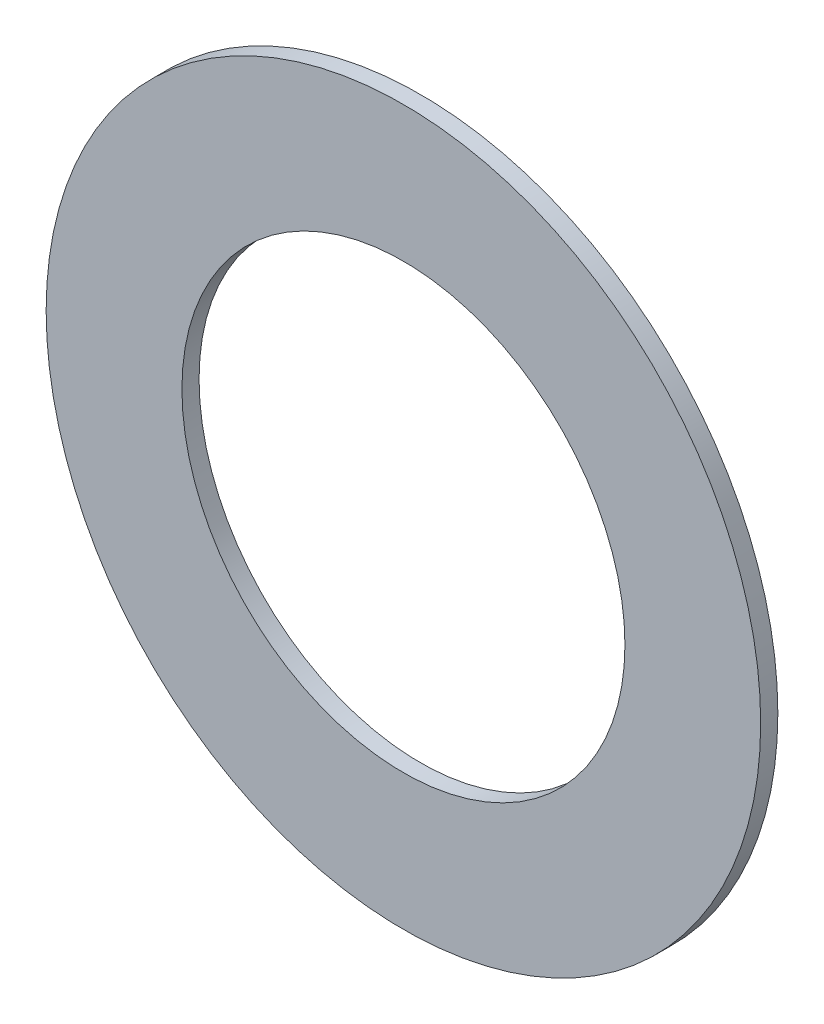
ISO-10303-21;
HEADER;
FILE_DESCRIPTION(('STEP AP214'),'2;1');
FILE_NAME('part.step','',(''),(''),'','','');
FILE_SCHEMA(('AUTOMOTIVE_DESIGN { 1 0 10303 214 1 1 1 1 }'));
ENDSEC;
DATA;
#1=APPLICATION_CONTEXT('core data for automotive mechanical design processes');
#2=APPLICATION_PROTOCOL_DEFINITION('international standard','automotive_design',2000,#1);
#3=PRODUCT_CONTEXT('',#1,'mechanical');
#4=PRODUCT('Part','Part','',(#3));
#5=PRODUCT_RELATED_PRODUCT_CATEGORY('part','',(#4));
#6=PRODUCT_DEFINITION_FORMATION('','',#4);
#7=PRODUCT_DEFINITION_CONTEXT('part definition',#1,'design');
#8=PRODUCT_DEFINITION('design','',#6,#7);
#9=PRODUCT_DEFINITION_SHAPE('','',#8);
#10=(LENGTH_UNIT() NAMED_UNIT(*) SI_UNIT(.MILLI.,.METRE.));
#11=(NAMED_UNIT(*) PLANE_ANGLE_UNIT() SI_UNIT($,.RADIAN.));
#12=(NAMED_UNIT(*) SI_UNIT($,.STERADIAN.) SOLID_ANGLE_UNIT());
#13=UNCERTAINTY_MEASURE_WITH_UNIT(LENGTH_MEASURE(1.E-05),#10,'distance_accuracy_value','');
#14=(GEOMETRIC_REPRESENTATION_CONTEXT(3) GLOBAL_UNCERTAINTY_ASSIGNED_CONTEXT((#13)) GLOBAL_UNIT_ASSIGNED_CONTEXT((#10,
#11,#12)) REPRESENTATION_CONTEXT('',''));
#15=CARTESIAN_POINT('',(0.,0.,0.));
#16=DIRECTION('',(0.,0.,1.));
#17=DIRECTION('',(1.,0.,0.));
#18=AXIS2_PLACEMENT_3D('',#15,#16,#17);
#19=CARTESIAN_POINT('',(0.,0.,3.048));
#20=DIRECTION('',(0.,0.,1.));
#21=DIRECTION('',(1.,0.,0.));
#22=AXIS2_PLACEMENT_3D('',#19,#20,#21);
#23=PLANE('',#22);
#24=CARTESIAN_POINT('',(0.,0.,3.048));
#25=DIRECTION('',(0.,0.,1.));
#26=DIRECTION('',(1.,0.,0.));
#27=AXIS2_PLACEMENT_3D('',#24,#25,#26);
#28=CIRCLE('',#27,63.5);
#29=CARTESIAN_POINT('',(-63.5,0.,3.048));
#30=VERTEX_POINT('',#29);
#31=EDGE_CURVE('E10',#30,#30,#28,.T.);
#32=ORIENTED_EDGE('',*,*,#31,.T.);
#33=EDGE_LOOP('',(#32));
#34=FACE_BOUND('',#33,.T.);
#35=CARTESIAN_POINT('',(0.,0.,3.048));
#36=DIRECTION('',(0.,0.,1.));
#37=DIRECTION('',(1.,0.,0.));
#38=AXIS2_PLACEMENT_3D('',#35,#36,#37);
#39=CIRCLE('',#38,39.37);
#40=CARTESIAN_POINT('',(-39.37,0.,3.048));
#41=VERTEX_POINT('',#40);
#42=EDGE_CURVE('E53',#41,#41,#39,.T.);
#43=ORIENTED_EDGE('',*,*,#42,.F.);
#44=EDGE_LOOP('',(#43));
#45=FACE_BOUND('',#44,.T.);
#46=ADVANCED_FACE('F39',(#34,#45),#23,.T.);
#47=CARTESIAN_POINT('',(0.,0.,0.));
#48=DIRECTION('',(0.,0.,1.));
#49=DIRECTION('',(1.,0.,0.));
#50=AXIS2_PLACEMENT_3D('',#47,#48,#49);
#51=PLANE('',#50);
#52=CARTESIAN_POINT('',(0.,0.,0.));
#53=DIRECTION('',(0.,0.,1.));
#54=DIRECTION('',(1.,0.,0.));
#55=AXIS2_PLACEMENT_3D('',#52,#53,#54);
#56=CIRCLE('',#55,63.5);
#57=CARTESIAN_POINT('',(-63.5,0.,0.));
#58=VERTEX_POINT('',#57);
#59=EDGE_CURVE('E43',#58,#58,#56,.T.);
#60=ORIENTED_EDGE('',*,*,#59,.F.);
#61=EDGE_LOOP('',(#60));
#62=FACE_BOUND('',#61,.T.);
#63=CARTESIAN_POINT('',(0.,0.,0.));
#64=DIRECTION('',(0.,0.,1.));
#65=DIRECTION('',(1.,0.,0.));
#66=AXIS2_PLACEMENT_3D('',#63,#64,#65);
#67=CIRCLE('',#66,39.37);
#68=CARTESIAN_POINT('',(-39.37,0.,0.));
#69=VERTEX_POINT('',#68);
#70=EDGE_CURVE('E55',#69,#69,#67,.T.);
#71=ORIENTED_EDGE('',*,*,#70,.T.);
#72=EDGE_LOOP('',(#71));
#73=FACE_BOUND('',#72,.T.);
#74=ADVANCED_FACE('F66',(#62,#73),#51,.F.);
#75=CARTESIAN_POINT('',(0.,0.,3.048));
#76=DIRECTION('',(0.,0.,-1.));
#77=DIRECTION('',(-1.,0.,0.));
#78=AXIS2_PLACEMENT_3D('',#75,#76,#77);
#79=CYLINDRICAL_SURFACE('',#78,63.5);
#80=CARTESIAN_POINT('',(-63.5,0.,3.048));
#81=CARTESIAN_POINT('',(-63.5,0.,3.01625));
#82=CARTESIAN_POINT('',(-63.5,0.,2.9845));
#83=CARTESIAN_POINT('',(-63.5,0.,2.921));
#84=CARTESIAN_POINT('',(-63.5,0.,2.88925));
#85=CARTESIAN_POINT('',(-63.5,0.,2.82575));
#86=CARTESIAN_POINT('',(-63.5,0.,2.794));
#87=CARTESIAN_POINT('',(-63.5,0.,2.7305));
#88=CARTESIAN_POINT('',(-63.5,0.,2.69875));
#89=CARTESIAN_POINT('',(-63.5,0.,2.63525));
#90=CARTESIAN_POINT('',(-63.5,0.,2.6035));
#91=CARTESIAN_POINT('',(-63.5,0.,2.54));
#92=CARTESIAN_POINT('',(-63.5,0.,2.50825));
#93=CARTESIAN_POINT('',(-63.5,0.,2.44475));
#94=CARTESIAN_POINT('',(-63.5,0.,2.413));
#95=CARTESIAN_POINT('',(-63.5,0.,2.3495));
#96=CARTESIAN_POINT('',(-63.5,0.,2.31775));
#97=CARTESIAN_POINT('',(-63.5,0.,2.25425));
#98=CARTESIAN_POINT('',(-63.5,0.,2.2225));
#99=CARTESIAN_POINT('',(-63.5,0.,2.159));
#100=CARTESIAN_POINT('',(-63.5,0.,2.12725));
#101=CARTESIAN_POINT('',(-63.5,0.,2.06375));
#102=CARTESIAN_POINT('',(-63.5,0.,2.032));
#103=CARTESIAN_POINT('',(-63.5,0.,1.9685));
#104=CARTESIAN_POINT('',(-63.5,0.,1.93675));
#105=CARTESIAN_POINT('',(-63.5,0.,1.87325));
#106=CARTESIAN_POINT('',(-63.5,0.,1.8415));
#107=CARTESIAN_POINT('',(-63.5,0.,1.778));
#108=CARTESIAN_POINT('',(-63.5,0.,1.74625));
#109=CARTESIAN_POINT('',(-63.5,0.,1.68275));
#110=CARTESIAN_POINT('',(-63.5,0.,1.651));
#111=CARTESIAN_POINT('',(-63.5,0.,1.5875));
#112=CARTESIAN_POINT('',(-63.5,0.,1.55575));
#113=CARTESIAN_POINT('',(-63.5,0.,1.49225));
#114=CARTESIAN_POINT('',(-63.5,0.,1.4605));
#115=CARTESIAN_POINT('',(-63.5,0.,1.397));
#116=CARTESIAN_POINT('',(-63.5,0.,1.36525));
#117=CARTESIAN_POINT('',(-63.5,0.,1.30175));
#118=CARTESIAN_POINT('',(-63.5,0.,1.27));
#119=CARTESIAN_POINT('',(-63.5,0.,1.2065));
#120=CARTESIAN_POINT('',(-63.5,0.,1.17475));
#121=CARTESIAN_POINT('',(-63.5,0.,1.11125));
#122=CARTESIAN_POINT('',(-63.5,0.,1.0795));
#123=CARTESIAN_POINT('',(-63.5,0.,1.016));
#124=CARTESIAN_POINT('',(-63.5,0.,0.98425));
#125=CARTESIAN_POINT('',(-63.5,0.,0.92075));
#126=CARTESIAN_POINT('',(-63.5,0.,0.889));
#127=CARTESIAN_POINT('',(-63.5,0.,0.8255));
#128=CARTESIAN_POINT('',(-63.5,0.,0.79375));
#129=CARTESIAN_POINT('',(-63.5,0.,0.73025));
#130=CARTESIAN_POINT('',(-63.5,0.,0.6985));
#131=CARTESIAN_POINT('',(-63.5,0.,0.635));
#132=CARTESIAN_POINT('',(-63.5,0.,0.60325));
#133=CARTESIAN_POINT('',(-63.5,0.,0.53975));
#134=CARTESIAN_POINT('',(-63.5,0.,0.508));
#135=CARTESIAN_POINT('',(-63.5,0.,0.4445));
#136=CARTESIAN_POINT('',(-63.5,0.,0.41275));
#137=CARTESIAN_POINT('',(-63.5,0.,0.34925));
#138=CARTESIAN_POINT('',(-63.5,0.,0.3175));
#139=CARTESIAN_POINT('',(-63.5,0.,0.254));
#140=CARTESIAN_POINT('',(-63.5,0.,0.22225));
#141=CARTESIAN_POINT('',(-63.5,0.,0.15875));
#142=CARTESIAN_POINT('',(-63.5,0.,0.127));
#143=CARTESIAN_POINT('',(-63.5,0.,0.0634999999999999));
#144=CARTESIAN_POINT('',(-63.5,0.,0.03175));
#145=CARTESIAN_POINT('',(-63.5,0.,0.));
#146=B_SPLINE_CURVE_WITH_KNOTS('',3,(#80,#81,#82,#83,#84,#85,#86,#87,#88,#89,#90,#91,#92,#93,
#94,#95,#96,#97,#98,#99,#100,#101,#102,#103,#104,#105,#106,#107,#108,#109,#110,#111,#112,#113,
#114,#115,#116,#117,#118,#119,#120,#121,#122,#123,#124,#125,#126,#127,#128,#129,#130,#131,#132,
#133,#134,#135,#136,#137,#138,#139,#140,#141,#142,#143,#144,#145),.UNSPECIFIED.,.F.,.F.,(4,2,2,
2,2,2,2,2,2,2,2,2,2,2,2,2,2,2,2,2,2,2,2,2,2,2,2,2,2,2,2,2,4),(0.,0.0952500000000003,0.1905,
0.28575,0.381,0.47625,0.5715,0.66675,0.762,0.85725,0.9525,1.04775,1.143,1.23825,1.3335,1.42875,
1.524,1.61925,1.7145,1.80975,1.905,2.00025,2.0955,2.19075,2.286,2.38125,2.4765,2.57175,2.667,
2.76225,2.8575,2.95275,3.048),.UNSPECIFIED.);
#147=EDGE_CURVE('BSEAM41',#30,#58,#146,.T.);
#148=ORIENTED_EDGE('',*,*,#31,.F.);
#149=ORIENTED_EDGE('',*,*,#59,.T.);
#150=ORIENTED_EDGE('',*,*,#147,.T.);
#151=ORIENTED_EDGE('',*,*,#147,.F.);
#152=EDGE_LOOP('',(#148,#150,#149,#151));
#153=FACE_BOUND('',#152,.T.);
#154=ADVANCED_FACE('F41',(#153),#79,.T.);
#155=CARTESIAN_POINT('',(0.,0.,3.048));
#156=DIRECTION('',(0.,0.,-1.));
#157=DIRECTION('',(-1.,0.,0.));
#158=AXIS2_PLACEMENT_3D('',#155,#156,#157);
#159=CYLINDRICAL_SURFACE('',#158,39.37);
#160=CARTESIAN_POINT('',(-39.37,0.,3.048));
#161=CARTESIAN_POINT('',(-39.37,0.,3.01625));
#162=CARTESIAN_POINT('',(-39.37,0.,2.9845));
#163=CARTESIAN_POINT('',(-39.37,0.,2.921));
#164=CARTESIAN_POINT('',(-39.37,0.,2.88925));
#165=CARTESIAN_POINT('',(-39.37,0.,2.82575));
#166=CARTESIAN_POINT('',(-39.37,0.,2.794));
#167=CARTESIAN_POINT('',(-39.37,0.,2.7305));
#168=CARTESIAN_POINT('',(-39.37,0.,2.69875));
#169=CARTESIAN_POINT('',(-39.37,0.,2.63525));
#170=CARTESIAN_POINT('',(-39.37,0.,2.6035));
#171=CARTESIAN_POINT('',(-39.37,0.,2.54));
#172=CARTESIAN_POINT('',(-39.37,0.,2.50825));
#173=CARTESIAN_POINT('',(-39.37,0.,2.44475));
#174=CARTESIAN_POINT('',(-39.37,0.,2.413));
#175=CARTESIAN_POINT('',(-39.37,0.,2.3495));
#176=CARTESIAN_POINT('',(-39.37,0.,2.31775));
#177=CARTESIAN_POINT('',(-39.37,0.,2.25425));
#178=CARTESIAN_POINT('',(-39.37,0.,2.2225));
#179=CARTESIAN_POINT('',(-39.37,0.,2.159));
#180=CARTESIAN_POINT('',(-39.37,0.,2.12725));
#181=CARTESIAN_POINT('',(-39.37,0.,2.06375));
#182=CARTESIAN_POINT('',(-39.37,0.,2.032));
#183=CARTESIAN_POINT('',(-39.37,0.,1.9685));
#184=CARTESIAN_POINT('',(-39.37,0.,1.93675));
#185=CARTESIAN_POINT('',(-39.37,0.,1.87325));
#186=CARTESIAN_POINT('',(-39.37,0.,1.8415));
#187=CARTESIAN_POINT('',(-39.37,0.,1.778));
#188=CARTESIAN_POINT('',(-39.37,0.,1.74625));
#189=CARTESIAN_POINT('',(-39.37,0.,1.68275));
#190=CARTESIAN_POINT('',(-39.37,0.,1.651));
#191=CARTESIAN_POINT('',(-39.37,0.,1.5875));
#192=CARTESIAN_POINT('',(-39.37,0.,1.55575));
#193=CARTESIAN_POINT('',(-39.37,0.,1.49225));
#194=CARTESIAN_POINT('',(-39.37,0.,1.4605));
#195=CARTESIAN_POINT('',(-39.37,0.,1.397));
#196=CARTESIAN_POINT('',(-39.37,0.,1.36525));
#197=CARTESIAN_POINT('',(-39.37,0.,1.30175));
#198=CARTESIAN_POINT('',(-39.37,0.,1.27));
#199=CARTESIAN_POINT('',(-39.37,0.,1.2065));
#200=CARTESIAN_POINT('',(-39.37,0.,1.17475));
#201=CARTESIAN_POINT('',(-39.37,0.,1.11125));
#202=CARTESIAN_POINT('',(-39.37,0.,1.0795));
#203=CARTESIAN_POINT('',(-39.37,0.,1.016));
#204=CARTESIAN_POINT('',(-39.37,0.,0.98425));
#205=CARTESIAN_POINT('',(-39.37,0.,0.92075));
#206=CARTESIAN_POINT('',(-39.37,0.,0.889));
#207=CARTESIAN_POINT('',(-39.37,0.,0.8255));
#208=CARTESIAN_POINT('',(-39.37,0.,0.79375));
#209=CARTESIAN_POINT('',(-39.37,0.,0.73025));
#210=CARTESIAN_POINT('',(-39.37,0.,0.6985));
#211=CARTESIAN_POINT('',(-39.37,0.,0.635));
#212=CARTESIAN_POINT('',(-39.37,0.,0.60325));
#213=CARTESIAN_POINT('',(-39.37,0.,0.53975));
#214=CARTESIAN_POINT('',(-39.37,0.,0.508));
#215=CARTESIAN_POINT('',(-39.37,0.,0.4445));
#216=CARTESIAN_POINT('',(-39.37,0.,0.41275));
#217=CARTESIAN_POINT('',(-39.37,0.,0.34925));
#218=CARTESIAN_POINT('',(-39.37,0.,0.3175));
#219=CARTESIAN_POINT('',(-39.37,0.,0.254));
#220=CARTESIAN_POINT('',(-39.37,0.,0.22225));
#221=CARTESIAN_POINT('',(-39.37,0.,0.15875));
#222=CARTESIAN_POINT('',(-39.37,0.,0.127));
#223=CARTESIAN_POINT('',(-39.37,0.,0.0634999999999999));
#224=CARTESIAN_POINT('',(-39.37,0.,0.03175));
#225=CARTESIAN_POINT('',(-39.37,0.,0.));
#226=B_SPLINE_CURVE_WITH_KNOTS('',3,(#160,#161,#162,#163,#164,#165,#166,#167,#168,#169,#170,
#171,#172,#173,#174,#175,#176,#177,#178,#179,#180,#181,#182,#183,#184,#185,#186,#187,#188,#189,
#190,#191,#192,#193,#194,#195,#196,#197,#198,#199,#200,#201,#202,#203,#204,#205,#206,#207,#208,
#209,#210,#211,#212,#213,#214,#215,#216,#217,#218,#219,#220,#221,#222,#223,#224,#225),
.UNSPECIFIED.,.F.,.F.,(4,2,2,2,2,2,2,2,2,2,2,2,2,2,2,2,2,2,2,2,2,2,2,2,2,2,2,2,2,2,2,2,4),(0.,
0.0952500000000003,0.1905,0.28575,0.381,0.47625,0.5715,0.66675,0.762,0.85725,0.9525,1.04775,
1.143,1.23825,1.3335,1.42875,1.524,1.61925,1.7145,1.80975,1.905,2.00025,2.0955,2.19075,2.286,
2.38125,2.4765,2.57175,2.667,2.76225,2.8575,2.95275,3.048),.UNSPECIFIED.);
#227=EDGE_CURVE('BSEAM62',#41,#69,#226,.T.);
#228=ORIENTED_EDGE('',*,*,#42,.T.);
#229=ORIENTED_EDGE('',*,*,#70,.F.);
#230=ORIENTED_EDGE('',*,*,#227,.T.);
#231=ORIENTED_EDGE('',*,*,#227,.F.);
#232=EDGE_LOOP('',(#228,#230,#229,#231));
#233=FACE_BOUND('',#232,.T.);
#234=ADVANCED_FACE('F62',(#233),#159,.F.);
#235=CLOSED_SHELL('',(#46,#74,#154,#234));
#236=MANIFOLD_SOLID_BREP('B2',#235);
#237=ADVANCED_BREP_SHAPE_REPRESENTATION('',(#18,#236),#14);
#238=SHAPE_DEFINITION_REPRESENTATION(#9,#237);
ENDSEC;
END-ISO-10303-21;
